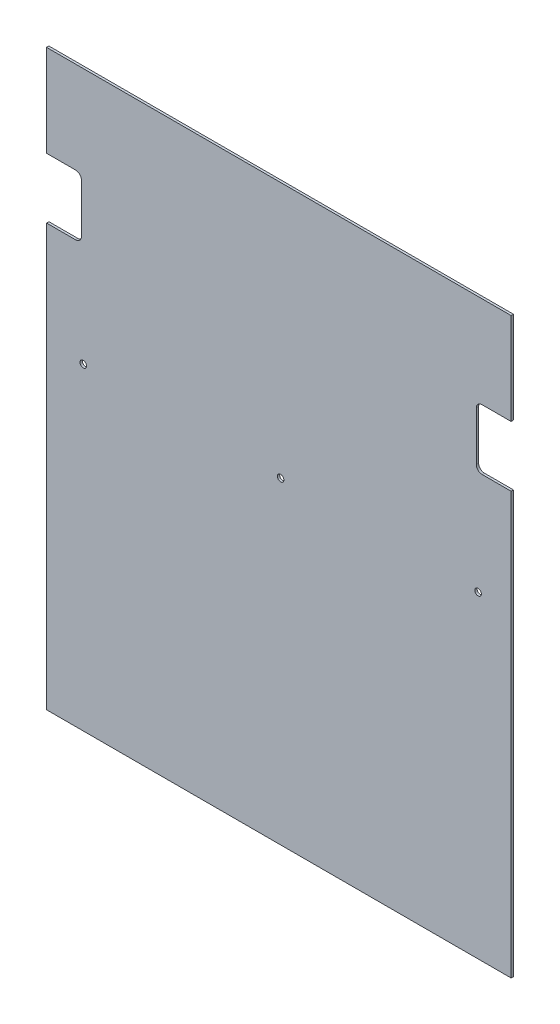
ISO-10303-21;
HEADER;
FILE_DESCRIPTION(('STEP AP214'),'2;1');
FILE_NAME('part.step','',(''),(''),'','','');
FILE_SCHEMA(('AUTOMOTIVE_DESIGN { 1 0 10303 214 1 1 1 1 }'));
ENDSEC;
DATA;
#1=APPLICATION_CONTEXT('core data for automotive mechanical design processes');
#2=APPLICATION_PROTOCOL_DEFINITION('international standard','automotive_design',2000,#1);
#3=PRODUCT_CONTEXT('',#1,'mechanical');
#4=PRODUCT('Part','Part','',(#3));
#5=PRODUCT_RELATED_PRODUCT_CATEGORY('part','',(#4));
#6=PRODUCT_DEFINITION_FORMATION('','',#4);
#7=PRODUCT_DEFINITION_CONTEXT('part definition',#1,'design');
#8=PRODUCT_DEFINITION('design','',#6,#7);
#9=PRODUCT_DEFINITION_SHAPE('','',#8);
#10=(LENGTH_UNIT() NAMED_UNIT(*) SI_UNIT(.MILLI.,.METRE.));
#11=(NAMED_UNIT(*) PLANE_ANGLE_UNIT() SI_UNIT($,.RADIAN.));
#12=(NAMED_UNIT(*) SI_UNIT($,.STERADIAN.) SOLID_ANGLE_UNIT());
#13=UNCERTAINTY_MEASURE_WITH_UNIT(LENGTH_MEASURE(1.E-05),#10,'distance_accuracy_value','');
#14=(GEOMETRIC_REPRESENTATION_CONTEXT(3) GLOBAL_UNCERTAINTY_ASSIGNED_CONTEXT((#13)) GLOBAL_UNIT_ASSIGNED_CONTEXT((#10,
#11,#12)) REPRESENTATION_CONTEXT('',''));
#15=CARTESIAN_POINT('',(0.,0.,0.));
#16=DIRECTION('',(0.,0.,1.));
#17=DIRECTION('',(1.,0.,0.));
#18=AXIS2_PLACEMENT_3D('',#15,#16,#17);
#19=CARTESIAN_POINT('',(200.,0.,2.));
#20=DIRECTION('',(1.,0.,0.));
#21=DIRECTION('',(0.,1.,0.));
#22=AXIS2_PLACEMENT_3D('',#19,#20,#21);
#23=PLANE('',#22);
#24=DIRECTION('',(0.,0.,1.));
#25=VECTOR('',#24,1.);
#26=CARTESIAN_POINT('',(200.,-131.,-8.));
#27=LINE('',#26,#25);
#28=CARTESIAN_POINT('',(200.,-131.,0.));
#29=VERTEX_POINT('',#28);
#30=CARTESIAN_POINT('',(200.,-131.,2.));
#31=VERTEX_POINT('',#30);
#32=EDGE_CURVE('E175',#29,#31,#27,.T.);
#33=ORIENTED_EDGE('',*,*,#32,.T.);
#34=DIRECTION('',(0.,-1.,0.));
#35=VECTOR('',#34,1.);
#36=CARTESIAN_POINT('',(200.,0.,2.));
#37=LINE('',#36,#35);
#38=CARTESIAN_POINT('',(200.,-494.,2.));
#39=VERTEX_POINT('',#38);
#40=EDGE_CURVE('E284',#31,#39,#37,.T.);
#41=ORIENTED_EDGE('',*,*,#40,.T.);
#42=DIRECTION('',(0.,0.,-1.));
#43=VECTOR('',#42,1.);
#44=CARTESIAN_POINT('',(200.,-494.,2.));
#45=LINE('',#44,#43);
#46=CARTESIAN_POINT('',(200.,-494.,0.));
#47=VERTEX_POINT('',#46);
#48=EDGE_CURVE('E210',#39,#47,#45,.T.);
#49=ORIENTED_EDGE('',*,*,#48,.T.);
#50=DIRECTION('',(0.,-1.,0.));
#51=VECTOR('',#50,1.);
#52=CARTESIAN_POINT('',(200.,0.,0.));
#53=LINE('',#52,#51);
#54=EDGE_CURVE('E193',#29,#47,#53,.T.);
#55=ORIENTED_EDGE('',*,*,#54,.F.);
#56=EDGE_LOOP('',(#33,#41,#49,#55));
#57=FACE_BOUND('',#56,.T.);
#58=ADVANCED_FACE('F39',(#57),#23,.T.);
#59=CARTESIAN_POINT('',(-200.,0.,2.));
#60=DIRECTION('',(1.,0.,0.));
#61=DIRECTION('',(0.,1.,0.));
#62=AXIS2_PLACEMENT_3D('',#59,#60,#61);
#63=PLANE('',#62);
#64=DIRECTION('',(0.,-1.,0.));
#65=VECTOR('',#64,1.);
#66=CARTESIAN_POINT('',(-200.,0.,0.));
#67=LINE('',#66,#65);
#68=CARTESIAN_POINT('',(-200.,0.,0.));
#69=VERTEX_POINT('',#68);
#70=CARTESIAN_POINT('',(-200.,-79.,0.));
#71=VERTEX_POINT('',#70);
#72=EDGE_CURVE('E201',#69,#71,#67,.T.);
#73=ORIENTED_EDGE('',*,*,#72,.T.);
#74=DIRECTION('',(0.,0.,1.));
#75=VECTOR('',#74,1.);
#76=CARTESIAN_POINT('',(-200.,-79.,-8.));
#77=LINE('',#76,#75);
#78=CARTESIAN_POINT('',(-200.,-79.,2.));
#79=VERTEX_POINT('',#78);
#80=EDGE_CURVE('E163',#71,#79,#77,.T.);
#81=ORIENTED_EDGE('',*,*,#80,.T.);
#82=DIRECTION('',(0.,-1.,0.));
#83=VECTOR('',#82,1.);
#84=CARTESIAN_POINT('',(-200.,0.,2.));
#85=LINE('',#84,#83);
#86=CARTESIAN_POINT('',(-200.,0.,2.));
#87=VERTEX_POINT('',#86);
#88=EDGE_CURVE('E181',#87,#79,#85,.T.);
#89=ORIENTED_EDGE('',*,*,#88,.F.);
#90=DIRECTION('',(0.,0.,-1.));
#91=VECTOR('',#90,1.);
#92=CARTESIAN_POINT('',(-200.,0.,2.));
#93=LINE('',#92,#91);
#94=EDGE_CURVE('E206',#87,#69,#93,.T.);
#95=ORIENTED_EDGE('',*,*,#94,.T.);
#96=EDGE_LOOP('',(#73,#81,#89,#95));
#97=FACE_BOUND('',#96,.T.);
#98=ADVANCED_FACE('F324',(#97),#63,.F.);
#99=CARTESIAN_POINT('',(0.,-494.,2.));
#100=DIRECTION('',(0.,1.,0.));
#101=DIRECTION('',(-1.,0.,0.));
#102=AXIS2_PLACEMENT_3D('',#99,#100,#101);
#103=PLANE('',#102);
#104=DIRECTION('',(1.,0.,0.));
#105=VECTOR('',#104,1.);
#106=CARTESIAN_POINT('',(0.,-494.,0.));
#107=LINE('',#106,#105);
#108=CARTESIAN_POINT('',(-200.,-494.,0.));
#109=VERTEX_POINT('',#108);
#110=EDGE_CURVE('E190',#109,#47,#107,.T.);
#111=ORIENTED_EDGE('',*,*,#110,.T.);
#112=ORIENTED_EDGE('',*,*,#48,.F.);
#113=DIRECTION('',(1.,0.,0.));
#114=VECTOR('',#113,1.);
#115=CARTESIAN_POINT('',(0.,-494.,2.));
#116=LINE('',#115,#114);
#117=CARTESIAN_POINT('',(-200.,-494.,2.));
#118=VERTEX_POINT('',#117);
#119=EDGE_CURVE('E204',#118,#39,#116,.T.);
#120=ORIENTED_EDGE('',*,*,#119,.F.);
#121=DIRECTION('',(0.,0.,-1.));
#122=VECTOR('',#121,1.);
#123=CARTESIAN_POINT('',(-200.,-494.,2.));
#124=LINE('',#123,#122);
#125=EDGE_CURVE('E179',#118,#109,#124,.T.);
#126=ORIENTED_EDGE('',*,*,#125,.T.);
#127=EDGE_LOOP('',(#111,#112,#120,#126));
#128=FACE_BOUND('',#127,.T.);
#129=ADVANCED_FACE('F296',(#128),#103,.F.);
#130=DIRECTION('',(0.,0.,1.));
#131=VECTOR('',#130,1.);
#132=CARTESIAN_POINT('',(200.,-78.9999999999999,-8.));
#133=LINE('',#132,#131);
#134=CARTESIAN_POINT('',(200.,-78.9999999999999,0.));
#135=VERTEX_POINT('',#134);
#136=CARTESIAN_POINT('',(200.,-78.9999999999999,2.));
#137=VERTEX_POINT('',#136);
#138=EDGE_CURVE('E280',#135,#137,#133,.T.);
#139=ORIENTED_EDGE('',*,*,#138,.F.);
#140=CARTESIAN_POINT('',(200.,0.,0.));
#141=VERTEX_POINT('',#140);
#142=EDGE_CURVE('E194',#141,#135,#53,.T.);
#143=ORIENTED_EDGE('',*,*,#142,.F.);
#144=DIRECTION('',(0.,0.,-1.));
#145=VECTOR('',#144,1.);
#146=CARTESIAN_POINT('',(200.,0.,2.));
#147=LINE('',#146,#145);
#148=CARTESIAN_POINT('',(200.,0.,2.));
#149=VERTEX_POINT('',#148);
#150=EDGE_CURVE('E208',#149,#141,#147,.T.);
#151=ORIENTED_EDGE('',*,*,#150,.F.);
#152=EDGE_CURVE('E186',#149,#137,#37,.T.);
#153=ORIENTED_EDGE('',*,*,#152,.T.);
#154=EDGE_LOOP('',(#139,#143,#151,#153));
#155=FACE_BOUND('',#154,.T.);
#156=ADVANCED_FACE('F326',(#155),#23,.T.);
#157=CARTESIAN_POINT('',(0.,0.,2.));
#158=DIRECTION('',(0.,1.,0.));
#159=DIRECTION('',(-1.,0.,0.));
#160=AXIS2_PLACEMENT_3D('',#157,#158,#159);
#161=PLANE('',#160);
#162=DIRECTION('',(1.,0.,0.));
#163=VECTOR('',#162,1.);
#164=CARTESIAN_POINT('',(0.,0.,0.));
#165=LINE('',#164,#163);
#166=EDGE_CURVE('E197',#69,#141,#165,.T.);
#167=ORIENTED_EDGE('',*,*,#166,.F.);
#168=ORIENTED_EDGE('',*,*,#94,.F.);
#169=DIRECTION('',(1.,0.,0.));
#170=VECTOR('',#169,1.);
#171=CARTESIAN_POINT('',(0.,0.,2.));
#172=LINE('',#171,#170);
#173=EDGE_CURVE('E182',#87,#149,#172,.T.);
#174=ORIENTED_EDGE('',*,*,#173,.T.);
#175=ORIENTED_EDGE('',*,*,#150,.T.);
#176=EDGE_LOOP('',(#167,#168,#174,#175));
#177=FACE_BOUND('',#176,.T.);
#178=ADVANCED_FACE('F335',(#177),#161,.T.);
#179=CARTESIAN_POINT('',(-200.,-131.,2.));
#180=VERTEX_POINT('',#179);
#181=EDGE_CURVE('E170',#180,#118,#85,.T.);
#182=ORIENTED_EDGE('',*,*,#181,.F.);
#183=DIRECTION('',(0.,0.,1.));
#184=VECTOR('',#183,1.);
#185=CARTESIAN_POINT('',(-200.,-131.,-8.));
#186=LINE('',#185,#184);
#187=CARTESIAN_POINT('',(-200.,-131.,0.));
#188=VERTEX_POINT('',#187);
#189=EDGE_CURVE('E153',#188,#180,#186,.T.);
#190=ORIENTED_EDGE('',*,*,#189,.F.);
#191=EDGE_CURVE('E200',#188,#109,#67,.T.);
#192=ORIENTED_EDGE('',*,*,#191,.T.);
#193=ORIENTED_EDGE('',*,*,#125,.F.);
#194=EDGE_LOOP('',(#182,#190,#192,#193));
#195=FACE_BOUND('',#194,.T.);
#196=ADVANCED_FACE('F177',(#195),#63,.F.);
#197=CARTESIAN_POINT('',(0.,0.,2.));
#198=DIRECTION('',(0.,0.,1.));
#199=DIRECTION('',(1.,0.,0.));
#200=AXIS2_PLACEMENT_3D('',#197,#198,#199);
#201=PLANE('',#200);
#202=CARTESIAN_POINT('',(-168.455486452755,-220.458154074216,2.));
#203=DIRECTION('',(0.,0.,-1.));
#204=DIRECTION('',(1.,0.,0.));
#205=AXIS2_PLACEMENT_3D('',#202,#203,#204);
#206=CIRCLE('',#205,2.82157287525372);
#207=CARTESIAN_POINT('',(-165.633913577501,-220.458154074216,2.));
#208=VERTEX_POINT('',#207);
#209=EDGE_CURVE('E476',#208,#208,#206,.T.);
#210=ORIENTED_EDGE('',*,*,#209,.T.);
#211=EDGE_LOOP('',(#210));
#212=FACE_BOUND('',#211,.T.);
#213=CARTESIAN_POINT('',(1.5445135472447,-220.458154074216,2.));
#214=DIRECTION('',(0.,0.,-1.));
#215=DIRECTION('',(-1.,0.,0.));
#216=AXIS2_PLACEMENT_3D('',#213,#214,#215);
#217=CIRCLE('',#216,2.82157287525376);
#218=CARTESIAN_POINT('',(4.36608642249846,-220.458154074216,2.));
#219=VERTEX_POINT('',#218);
#220=EDGE_CURVE('E477',#219,#219,#217,.T.);
#221=ORIENTED_EDGE('',*,*,#220,.T.);
#222=EDGE_LOOP('',(#221));
#223=FACE_BOUND('',#222,.T.);
#224=CARTESIAN_POINT('',(171.544513547245,-220.458154074216,2.));
#225=DIRECTION('',(0.,0.,-1.));
#226=DIRECTION('',(-1.,0.,0.));
#227=AXIS2_PLACEMENT_3D('',#224,#225,#226);
#228=CIRCLE('',#227,2.82157287525371);
#229=CARTESIAN_POINT('',(174.366086422498,-220.458154074216,2.));
#230=VERTEX_POINT('',#229);
#231=EDGE_CURVE('E260',#230,#230,#228,.T.);
#232=ORIENTED_EDGE('',*,*,#231,.T.);
#233=EDGE_LOOP('',(#232));
#234=FACE_BOUND('',#233,.T.);
#235=DIRECTION('',(-1.,0.,0.));
#236=VECTOR('',#235,1.);
#237=CARTESIAN_POINT('',(-200.,-79.,2.));
#238=LINE('',#237,#236);
#239=CARTESIAN_POINT('',(-175.,-79.,2.));
#240=VERTEX_POINT('',#239);
#241=EDGE_CURVE('E164',#240,#79,#238,.T.);
#242=ORIENTED_EDGE('',*,*,#241,.F.);
#243=CARTESIAN_POINT('',(-175.,-84.,2.));
#244=DIRECTION('',(0.,0.,1.));
#245=DIRECTION('',(1.,0.,0.));
#246=AXIS2_PLACEMENT_3D('',#243,#244,#245);
#247=CIRCLE('',#246,5.);
#248=CARTESIAN_POINT('',(-170.,-84.,2.));
#249=VERTEX_POINT('',#248);
#250=EDGE_CURVE('E48',#240,#249,#247,.F.);
#251=ORIENTED_EDGE('',*,*,#250,.T.);
#252=DIRECTION('',(0.,1.,0.));
#253=VECTOR('',#252,1.);
#254=CARTESIAN_POINT('',(-170.,-106.,2.));
#255=LINE('',#254,#253);
#256=CARTESIAN_POINT('',(-170.,-126.,2.));
#257=VERTEX_POINT('',#256);
#258=EDGE_CURVE('E174',#257,#249,#255,.T.);
#259=ORIENTED_EDGE('',*,*,#258,.F.);
#260=CARTESIAN_POINT('',(-175.,-126.,2.));
#261=DIRECTION('',(0.,0.,1.));
#262=DIRECTION('',(1.,0.,0.));
#263=AXIS2_PLACEMENT_3D('',#260,#261,#262);
#264=CIRCLE('',#263,5.);
#265=CARTESIAN_POINT('',(-175.,-131.,2.));
#266=VERTEX_POINT('',#265);
#267=EDGE_CURVE('E173',#257,#266,#264,.F.);
#268=ORIENTED_EDGE('',*,*,#267,.T.);
#269=DIRECTION('',(1.,0.,0.));
#270=VECTOR('',#269,1.);
#271=CARTESIAN_POINT('',(-200.,-131.,2.));
#272=LINE('',#271,#270);
#273=EDGE_CURVE('E156',#180,#266,#272,.T.);
#274=ORIENTED_EDGE('',*,*,#273,.F.);
#275=ORIENTED_EDGE('',*,*,#181,.T.);
#276=ORIENTED_EDGE('',*,*,#119,.T.);
#277=ORIENTED_EDGE('',*,*,#40,.F.);
#278=DIRECTION('',(1.,0.,0.));
#279=VECTOR('',#278,1.);
#280=CARTESIAN_POINT('',(200.,-131.,2.));
#281=LINE('',#280,#279);
#282=CARTESIAN_POINT('',(175.,-131.,2.));
#283=VERTEX_POINT('',#282);
#284=EDGE_CURVE('E275',#283,#31,#281,.T.);
#285=ORIENTED_EDGE('',*,*,#284,.F.);
#286=CARTESIAN_POINT('',(175.,-126.,2.));
#287=DIRECTION('',(0.,0.,1.));
#288=DIRECTION('',(1.,0.,0.));
#289=AXIS2_PLACEMENT_3D('',#286,#287,#288);
#290=CIRCLE('',#289,5.);
#291=CARTESIAN_POINT('',(170.,-126.,2.));
#292=VERTEX_POINT('',#291);
#293=EDGE_CURVE('E249',#283,#292,#290,.F.);
#294=ORIENTED_EDGE('',*,*,#293,.T.);
#295=DIRECTION('',(0.,-1.,0.));
#296=VECTOR('',#295,1.);
#297=CARTESIAN_POINT('',(170.,-131.,2.));
#298=LINE('',#297,#296);
#299=CARTESIAN_POINT('',(170.,-84.,2.));
#300=VERTEX_POINT('',#299);
#301=EDGE_CURVE('E269',#300,#292,#298,.T.);
#302=ORIENTED_EDGE('',*,*,#301,.F.);
#303=CARTESIAN_POINT('',(175.,-84.,2.));
#304=DIRECTION('',(0.,0.,1.));
#305=DIRECTION('',(1.,0.,0.));
#306=AXIS2_PLACEMENT_3D('',#303,#304,#305);
#307=CIRCLE('',#306,5.);
#308=CARTESIAN_POINT('',(175.,-79.,2.));
#309=VERTEX_POINT('',#308);
#310=EDGE_CURVE('E245',#300,#309,#307,.F.);
#311=ORIENTED_EDGE('',*,*,#310,.T.);
#312=DIRECTION('',(-1.,0.,0.));
#313=VECTOR('',#312,1.);
#314=CARTESIAN_POINT('',(200.,-78.9999999999999,2.));
#315=LINE('',#314,#313);
#316=EDGE_CURVE('E265',#137,#309,#315,.T.);
#317=ORIENTED_EDGE('',*,*,#316,.F.);
#318=ORIENTED_EDGE('',*,*,#152,.F.);
#319=ORIENTED_EDGE('',*,*,#173,.F.);
#320=ORIENTED_EDGE('',*,*,#88,.T.);
#321=EDGE_LOOP('',(#242,#251,#259,#268,#274,#275,#276,#277,#285,#294,#302,#311,#317,#318,#319,#320));
#322=FACE_BOUND('',#321,.T.);
#323=ADVANCED_FACE('F168',(#212,#223,#234,#322),#201,.T.);
#324=CARTESIAN_POINT('',(0.,0.,0.));
#325=DIRECTION('',(0.,0.,1.));
#326=DIRECTION('',(1.,0.,0.));
#327=AXIS2_PLACEMENT_3D('',#324,#325,#326);
#328=PLANE('',#327);
#329=CARTESIAN_POINT('',(-168.455486452755,-220.458154074216,0.));
#330=DIRECTION('',(0.,0.,1.));
#331=DIRECTION('',(1.,0.,0.));
#332=AXIS2_PLACEMENT_3D('',#329,#330,#331);
#333=CIRCLE('',#332,2.82157287525372);
#334=CARTESIAN_POINT('',(-165.633913577501,-220.458154074216,0.));
#335=VERTEX_POINT('',#334);
#336=EDGE_CURVE('E43',#335,#335,#333,.F.);
#337=ORIENTED_EDGE('',*,*,#336,.F.);
#338=EDGE_LOOP('',(#337));
#339=FACE_BOUND('',#338,.T.);
#340=CARTESIAN_POINT('',(1.5445135472447,-220.458154074216,0.));
#341=DIRECTION('',(0.,0.,1.));
#342=DIRECTION('',(1.,0.,0.));
#343=AXIS2_PLACEMENT_3D('',#340,#341,#342);
#344=CIRCLE('',#343,2.82157287525376);
#345=CARTESIAN_POINT('',(4.36608642249846,-220.458154074216,0.));
#346=VERTEX_POINT('',#345);
#347=EDGE_CURVE('E259',#346,#346,#344,.F.);
#348=ORIENTED_EDGE('',*,*,#347,.F.);
#349=EDGE_LOOP('',(#348));
#350=FACE_BOUND('',#349,.T.);
#351=CARTESIAN_POINT('',(171.544513547245,-220.458154074216,0.));
#352=DIRECTION('',(0.,0.,1.));
#353=DIRECTION('',(1.,0.,0.));
#354=AXIS2_PLACEMENT_3D('',#351,#352,#353);
#355=CIRCLE('',#354,2.82157287525371);
#356=CARTESIAN_POINT('',(174.366086422498,-220.458154074216,0.));
#357=VERTEX_POINT('',#356);
#358=EDGE_CURVE('E257',#357,#357,#355,.F.);
#359=ORIENTED_EDGE('',*,*,#358,.F.);
#360=EDGE_LOOP('',(#359));
#361=FACE_BOUND('',#360,.T.);
#362=DIRECTION('',(1.,0.,0.));
#363=VECTOR('',#362,1.);
#364=CARTESIAN_POINT('',(0.,-131.,0.));
#365=LINE('',#364,#363);
#366=CARTESIAN_POINT('',(-175.,-131.,0.));
#367=VERTEX_POINT('',#366);
#368=EDGE_CURVE('E159',#188,#367,#365,.T.);
#369=ORIENTED_EDGE('',*,*,#368,.T.);
#370=CARTESIAN_POINT('',(-175.,-126.,0.));
#371=DIRECTION('',(0.,0.,1.));
#372=DIRECTION('',(1.,0.,0.));
#373=AXIS2_PLACEMENT_3D('',#370,#371,#372);
#374=CIRCLE('',#373,5.);
#375=CARTESIAN_POINT('',(-170.,-126.,0.));
#376=VERTEX_POINT('',#375);
#377=EDGE_CURVE('E254',#367,#376,#374,.T.);
#378=ORIENTED_EDGE('',*,*,#377,.T.);
#379=DIRECTION('',(0.,1.,0.));
#380=VECTOR('',#379,1.);
#381=CARTESIAN_POINT('',(-170.,0.,0.));
#382=LINE('',#381,#380);
#383=CARTESIAN_POINT('',(-170.,-84.,0.));
#384=VERTEX_POINT('',#383);
#385=EDGE_CURVE('E222',#376,#384,#382,.T.);
#386=ORIENTED_EDGE('',*,*,#385,.T.);
#387=CARTESIAN_POINT('',(-175.,-84.,0.));
#388=DIRECTION('',(0.,0.,1.));
#389=DIRECTION('',(1.,0.,0.));
#390=AXIS2_PLACEMENT_3D('',#387,#388,#389);
#391=CIRCLE('',#390,5.);
#392=CARTESIAN_POINT('',(-175.,-79.,0.));
#393=VERTEX_POINT('',#392);
#394=EDGE_CURVE('E11',#384,#393,#391,.T.);
#395=ORIENTED_EDGE('',*,*,#394,.T.);
#396=DIRECTION('',(-1.,0.,0.));
#397=VECTOR('',#396,1.);
#398=CARTESIAN_POINT('',(0.,-79.,0.));
#399=LINE('',#398,#397);
#400=EDGE_CURVE('E224',#393,#71,#399,.T.);
#401=ORIENTED_EDGE('',*,*,#400,.T.);
#402=ORIENTED_EDGE('',*,*,#72,.F.);
#403=ORIENTED_EDGE('',*,*,#166,.T.);
#404=ORIENTED_EDGE('',*,*,#142,.T.);
#405=DIRECTION('',(-1.,0.,0.));
#406=VECTOR('',#405,1.);
#407=CARTESIAN_POINT('',(0.,-79.,0.));
#408=LINE('',#407,#406);
#409=CARTESIAN_POINT('',(175.,-79.,0.));
#410=VERTEX_POINT('',#409);
#411=EDGE_CURVE('E213',#135,#410,#408,.T.);
#412=ORIENTED_EDGE('',*,*,#411,.T.);
#413=CARTESIAN_POINT('',(175.,-84.,0.));
#414=DIRECTION('',(0.,0.,1.));
#415=DIRECTION('',(1.,0.,0.));
#416=AXIS2_PLACEMENT_3D('',#413,#414,#415);
#417=CIRCLE('',#416,5.);
#418=CARTESIAN_POINT('',(170.,-84.,0.));
#419=VERTEX_POINT('',#418);
#420=EDGE_CURVE('E247',#410,#419,#417,.T.);
#421=ORIENTED_EDGE('',*,*,#420,.T.);
#422=DIRECTION('',(0.,-1.,0.));
#423=VECTOR('',#422,1.);
#424=CARTESIAN_POINT('',(170.,3.77475828372553E-13,0.));
#425=LINE('',#424,#423);
#426=CARTESIAN_POINT('',(170.,-126.,0.));
#427=VERTEX_POINT('',#426);
#428=EDGE_CURVE('E216',#419,#427,#425,.T.);
#429=ORIENTED_EDGE('',*,*,#428,.T.);
#430=CARTESIAN_POINT('',(175.,-126.,0.));
#431=DIRECTION('',(0.,0.,1.));
#432=DIRECTION('',(1.,0.,0.));
#433=AXIS2_PLACEMENT_3D('',#430,#431,#432);
#434=CIRCLE('',#433,5.);
#435=CARTESIAN_POINT('',(175.,-131.,0.));
#436=VERTEX_POINT('',#435);
#437=EDGE_CURVE('E251',#427,#436,#434,.T.);
#438=ORIENTED_EDGE('',*,*,#437,.T.);
#439=DIRECTION('',(1.,0.,0.));
#440=VECTOR('',#439,1.);
#441=CARTESIAN_POINT('',(0.,-131.,0.));
#442=LINE('',#441,#440);
#443=EDGE_CURVE('E219',#436,#29,#442,.T.);
#444=ORIENTED_EDGE('',*,*,#443,.T.);
#445=ORIENTED_EDGE('',*,*,#54,.T.);
#446=ORIENTED_EDGE('',*,*,#110,.F.);
#447=ORIENTED_EDGE('',*,*,#191,.F.);
#448=EDGE_LOOP('',(#369,#378,#386,#395,#401,#402,#403,#404,#412,#421,#429,#438,#444,#445,#446,#447));
#449=FACE_BOUND('',#448,.T.);
#450=ADVANCED_FACE('F298',(#339,#350,#361,#449),#328,.F.);
#451=CARTESIAN_POINT('',(200.,-131.,-8.));
#452=DIRECTION('',(0.,-1.,0.));
#453=DIRECTION('',(0.,0.,-1.));
#454=AXIS2_PLACEMENT_3D('',#451,#452,#453);
#455=PLANE('',#454);
#456=ORIENTED_EDGE('',*,*,#443,.F.);
#457=DIRECTION('',(0.,0.,1.));
#458=VECTOR('',#457,1.);
#459=CARTESIAN_POINT('',(175.,-131.,2.));
#460=LINE('',#459,#458);
#461=EDGE_CURVE('E233',#436,#283,#460,.T.);
#462=ORIENTED_EDGE('',*,*,#461,.T.);
#463=ORIENTED_EDGE('',*,*,#284,.T.);
#464=ORIENTED_EDGE('',*,*,#32,.F.);
#465=EDGE_LOOP('',(#456,#462,#463,#464));
#466=FACE_BOUND('',#465,.T.);
#467=ADVANCED_FACE('F303',(#466),#455,.F.);
#468=CARTESIAN_POINT('',(170.,-131.,-8.));
#469=DIRECTION('',(-1.,0.,0.));
#470=DIRECTION('',(0.,-1.,0.));
#471=AXIS2_PLACEMENT_3D('',#468,#469,#470);
#472=PLANE('',#471);
#473=ORIENTED_EDGE('',*,*,#428,.F.);
#474=DIRECTION('',(0.,0.,1.));
#475=VECTOR('',#474,1.);
#476=CARTESIAN_POINT('',(170.,-84.,2.));
#477=LINE('',#476,#475);
#478=EDGE_CURVE('E228',#419,#300,#477,.T.);
#479=ORIENTED_EDGE('',*,*,#478,.T.);
#480=ORIENTED_EDGE('',*,*,#301,.T.);
#481=DIRECTION('',(0.,0.,1.));
#482=VECTOR('',#481,1.);
#483=CARTESIAN_POINT('',(170.,-126.,0.));
#484=LINE('',#483,#482);
#485=EDGE_CURVE('E226',#292,#427,#484,.F.);
#486=ORIENTED_EDGE('',*,*,#485,.T.);
#487=EDGE_LOOP('',(#473,#479,#480,#486));
#488=FACE_BOUND('',#487,.T.);
#489=ADVANCED_FACE('F309',(#488),#472,.F.);
#490=CARTESIAN_POINT('',(200.,-78.9999999999999,-8.));
#491=DIRECTION('',(0.,1.,0.));
#492=DIRECTION('',(-1.,0.,0.));
#493=AXIS2_PLACEMENT_3D('',#490,#491,#492);
#494=PLANE('',#493);
#495=ORIENTED_EDGE('',*,*,#316,.T.);
#496=DIRECTION('',(0.,0.,1.));
#497=VECTOR('',#496,1.);
#498=CARTESIAN_POINT('',(175.,-79.,0.));
#499=LINE('',#498,#497);
#500=EDGE_CURVE('E231',#309,#410,#499,.F.);
#501=ORIENTED_EDGE('',*,*,#500,.T.);
#502=ORIENTED_EDGE('',*,*,#411,.F.);
#503=ORIENTED_EDGE('',*,*,#138,.T.);
#504=EDGE_LOOP('',(#495,#501,#502,#503));
#505=FACE_BOUND('',#504,.T.);
#506=ADVANCED_FACE('F347',(#505),#494,.F.);
#507=CARTESIAN_POINT('',(-200.,-79.,-8.));
#508=DIRECTION('',(0.,1.,0.));
#509=DIRECTION('',(0.,0.,1.));
#510=AXIS2_PLACEMENT_3D('',#507,#508,#509);
#511=PLANE('',#510);
#512=ORIENTED_EDGE('',*,*,#400,.F.);
#513=DIRECTION('',(0.,0.,1.));
#514=VECTOR('',#513,1.);
#515=CARTESIAN_POINT('',(-175.,-79.,2.));
#516=LINE('',#515,#514);
#517=EDGE_CURVE('E243',#393,#240,#516,.T.);
#518=ORIENTED_EDGE('',*,*,#517,.T.);
#519=ORIENTED_EDGE('',*,*,#241,.T.);
#520=ORIENTED_EDGE('',*,*,#80,.F.);
#521=EDGE_LOOP('',(#512,#518,#519,#520));
#522=FACE_BOUND('',#521,.T.);
#523=ADVANCED_FACE('F349',(#522),#511,.F.);
#524=CARTESIAN_POINT('',(-170.,-106.,-8.));
#525=DIRECTION('',(1.,0.,0.));
#526=DIRECTION('',(0.,0.,-1.));
#527=AXIS2_PLACEMENT_3D('',#524,#525,#526);
#528=PLANE('',#527);
#529=ORIENTED_EDGE('',*,*,#385,.F.);
#530=DIRECTION('',(0.,0.,1.));
#531=VECTOR('',#530,1.);
#532=CARTESIAN_POINT('',(-170.,-126.,2.));
#533=LINE('',#532,#531);
#534=EDGE_CURVE('E238',#376,#257,#533,.T.);
#535=ORIENTED_EDGE('',*,*,#534,.T.);
#536=ORIENTED_EDGE('',*,*,#258,.T.);
#537=DIRECTION('',(0.,0.,1.));
#538=VECTOR('',#537,1.);
#539=CARTESIAN_POINT('',(-170.,-84.,0.));
#540=LINE('',#539,#538);
#541=EDGE_CURVE('E236',#249,#384,#540,.F.);
#542=ORIENTED_EDGE('',*,*,#541,.T.);
#543=EDGE_LOOP('',(#529,#535,#536,#542));
#544=FACE_BOUND('',#543,.T.);
#545=ADVANCED_FACE('F355',(#544),#528,.F.);
#546=CARTESIAN_POINT('',(-200.,-131.,-8.));
#547=DIRECTION('',(0.,-1.,0.));
#548=DIRECTION('',(0.,0.,-1.));
#549=AXIS2_PLACEMENT_3D('',#546,#547,#548);
#550=PLANE('',#549);
#551=ORIENTED_EDGE('',*,*,#273,.T.);
#552=DIRECTION('',(0.,0.,1.));
#553=VECTOR('',#552,1.);
#554=CARTESIAN_POINT('',(-175.,-131.,0.));
#555=LINE('',#554,#553);
#556=EDGE_CURVE('E241',#266,#367,#555,.F.);
#557=ORIENTED_EDGE('',*,*,#556,.T.);
#558=ORIENTED_EDGE('',*,*,#368,.F.);
#559=ORIENTED_EDGE('',*,*,#189,.T.);
#560=EDGE_LOOP('',(#551,#557,#558,#559));
#561=FACE_BOUND('',#560,.T.);
#562=ADVANCED_FACE('F155',(#561),#550,.F.);
#563=CARTESIAN_POINT('',(175.,-84.,-8.));
#564=DIRECTION('',(0.,0.,-1.));
#565=DIRECTION('',(-1.,0.,0.));
#566=AXIS2_PLACEMENT_3D('',#563,#564,#565);
#567=CYLINDRICAL_SURFACE('',#566,5.);
#568=ORIENTED_EDGE('',*,*,#420,.F.);
#569=ORIENTED_EDGE('',*,*,#500,.F.);
#570=ORIENTED_EDGE('',*,*,#310,.F.);
#571=ORIENTED_EDGE('',*,*,#478,.F.);
#572=EDGE_LOOP('',(#568,#569,#570,#571));
#573=FACE_BOUND('',#572,.T.);
#574=ADVANCED_FACE('F314',(#573),#567,.F.);
#575=CARTESIAN_POINT('',(175.,-126.,-8.));
#576=DIRECTION('',(0.,0.,-1.));
#577=DIRECTION('',(-1.,0.,0.));
#578=AXIS2_PLACEMENT_3D('',#575,#576,#577);
#579=CYLINDRICAL_SURFACE('',#578,5.);
#580=ORIENTED_EDGE('',*,*,#437,.F.);
#581=ORIENTED_EDGE('',*,*,#485,.F.);
#582=ORIENTED_EDGE('',*,*,#293,.F.);
#583=ORIENTED_EDGE('',*,*,#461,.F.);
#584=EDGE_LOOP('',(#580,#581,#582,#583));
#585=FACE_BOUND('',#584,.T.);
#586=ADVANCED_FACE('F311',(#585),#579,.F.);
#587=CARTESIAN_POINT('',(-175.,-126.,-8.));
#588=DIRECTION('',(0.,0.,-1.));
#589=DIRECTION('',(-1.,0.,0.));
#590=AXIS2_PLACEMENT_3D('',#587,#588,#589);
#591=CYLINDRICAL_SURFACE('',#590,5.);
#592=ORIENTED_EDGE('',*,*,#377,.F.);
#593=ORIENTED_EDGE('',*,*,#556,.F.);
#594=ORIENTED_EDGE('',*,*,#267,.F.);
#595=ORIENTED_EDGE('',*,*,#534,.F.);
#596=EDGE_LOOP('',(#592,#593,#594,#595));
#597=FACE_BOUND('',#596,.T.);
#598=ADVANCED_FACE('F313',(#597),#591,.F.);
#599=CARTESIAN_POINT('',(-175.,-84.,-8.));
#600=DIRECTION('',(0.,0.,-1.));
#601=DIRECTION('',(-1.,0.,0.));
#602=AXIS2_PLACEMENT_3D('',#599,#600,#601);
#603=CYLINDRICAL_SURFACE('',#602,5.);
#604=ORIENTED_EDGE('',*,*,#394,.F.);
#605=ORIENTED_EDGE('',*,*,#541,.F.);
#606=ORIENTED_EDGE('',*,*,#250,.F.);
#607=ORIENTED_EDGE('',*,*,#517,.F.);
#608=EDGE_LOOP('',(#604,#605,#606,#607));
#609=FACE_BOUND('',#608,.T.);
#610=ADVANCED_FACE('F41',(#609),#603,.F.);
#611=CARTESIAN_POINT('',(171.544513547245,-220.458154074216,-58.));
#612=DIRECTION('',(0.,0.,1.));
#613=DIRECTION('',(1.,0.,0.));
#614=AXIS2_PLACEMENT_3D('',#611,#612,#613);
#615=CYLINDRICAL_SURFACE('',#614,2.82157287525371);
#616=CARTESIAN_POINT('',(174.366086422498,-220.458154074216,2.));
#617=CARTESIAN_POINT('',(174.366086422498,-220.458154074216,1.97916666666667));
#618=CARTESIAN_POINT('',(174.366086422498,-220.458154074216,1.95833333333334));
#619=CARTESIAN_POINT('',(174.366086422498,-220.458154074216,1.91666666666667));
#620=CARTESIAN_POINT('',(174.366086422498,-220.458154074216,1.89583333333334));
#621=CARTESIAN_POINT('',(174.366086422498,-220.458154074216,1.85416666666667));
#622=CARTESIAN_POINT('',(174.366086422498,-220.458154074216,1.83333333333334));
#623=CARTESIAN_POINT('',(174.366086422498,-220.458154074216,1.79166666666667));
#624=CARTESIAN_POINT('',(174.366086422498,-220.458154074216,1.77083333333334));
#625=CARTESIAN_POINT('',(174.366086422498,-220.458154074216,1.72916666666667));
#626=CARTESIAN_POINT('',(174.366086422498,-220.458154074216,1.70833333333333));
#627=CARTESIAN_POINT('',(174.366086422498,-220.458154074216,1.66666666666667));
#628=CARTESIAN_POINT('',(174.366086422498,-220.458154074216,1.64583333333333));
#629=CARTESIAN_POINT('',(174.366086422498,-220.458154074216,1.60416666666667));
#630=CARTESIAN_POINT('',(174.366086422498,-220.458154074216,1.58333333333333));
#631=CARTESIAN_POINT('',(174.366086422498,-220.458154074216,1.54166666666667));
#632=CARTESIAN_POINT('',(174.366086422498,-220.458154074216,1.52083333333333));
#633=CARTESIAN_POINT('',(174.366086422498,-220.458154074216,1.47916666666667));
#634=CARTESIAN_POINT('',(174.366086422498,-220.458154074216,1.45833333333333));
#635=CARTESIAN_POINT('',(174.366086422498,-220.458154074216,1.41666666666667));
#636=CARTESIAN_POINT('',(174.366086422498,-220.458154074216,1.39583333333333));
#637=CARTESIAN_POINT('',(174.366086422498,-220.458154074216,1.35416666666667));
#638=CARTESIAN_POINT('',(174.366086422498,-220.458154074216,1.33333333333333));
#639=CARTESIAN_POINT('',(174.366086422498,-220.458154074216,1.29166666666667));
#640=CARTESIAN_POINT('',(174.366086422498,-220.458154074216,1.27083333333333));
#641=CARTESIAN_POINT('',(174.366086422498,-220.458154074216,1.22916666666667));
#642=CARTESIAN_POINT('',(174.366086422498,-220.458154074216,1.20833333333333));
#643=CARTESIAN_POINT('',(174.366086422498,-220.458154074216,1.16666666666667));
#644=CARTESIAN_POINT('',(174.366086422498,-220.458154074216,1.14583333333333));
#645=CARTESIAN_POINT('',(174.366086422498,-220.458154074216,1.10416666666667));
#646=CARTESIAN_POINT('',(174.366086422498,-220.458154074216,1.08333333333333));
#647=CARTESIAN_POINT('',(174.366086422498,-220.458154074216,1.04166666666667));
#648=CARTESIAN_POINT('',(174.366086422498,-220.458154074216,1.02083333333333));
#649=CARTESIAN_POINT('',(174.366086422498,-220.458154074216,0.979166666666668));
#650=CARTESIAN_POINT('',(174.366086422498,-220.458154074216,0.958333333333334));
#651=CARTESIAN_POINT('',(174.366086422498,-220.458154074216,0.916666666666668));
#652=CARTESIAN_POINT('',(174.366086422498,-220.458154074216,0.895833333333334));
#653=CARTESIAN_POINT('',(174.366086422498,-220.458154074216,0.854166666666667));
#654=CARTESIAN_POINT('',(174.366086422498,-220.458154074216,0.833333333333334));
#655=CARTESIAN_POINT('',(174.366086422498,-220.458154074216,0.791666666666667));
#656=CARTESIAN_POINT('',(174.366086422498,-220.458154074216,0.770833333333334));
#657=CARTESIAN_POINT('',(174.366086422498,-220.458154074216,0.729166666666667));
#658=CARTESIAN_POINT('',(174.366086422498,-220.458154074216,0.708333333333334));
#659=CARTESIAN_POINT('',(174.366086422498,-220.458154074216,0.666666666666667));
#660=CARTESIAN_POINT('',(174.366086422498,-220.458154074216,0.645833333333334));
#661=CARTESIAN_POINT('',(174.366086422498,-220.458154074216,0.604166666666667));
#662=CARTESIAN_POINT('',(174.366086422498,-220.458154074216,0.583333333333334));
#663=CARTESIAN_POINT('',(174.366086422498,-220.458154074216,0.541666666666667));
#664=CARTESIAN_POINT('',(174.366086422498,-220.458154074216,0.520833333333334));
#665=CARTESIAN_POINT('',(174.366086422498,-220.458154074216,0.479166666666667));
#666=CARTESIAN_POINT('',(174.366086422498,-220.458154074216,0.458333333333334));
#667=CARTESIAN_POINT('',(174.366086422498,-220.458154074216,0.416666666666667));
#668=CARTESIAN_POINT('',(174.366086422498,-220.458154074216,0.395833333333334));
#669=CARTESIAN_POINT('',(174.366086422498,-220.458154074216,0.354166666666667));
#670=CARTESIAN_POINT('',(174.366086422498,-220.458154074216,0.333333333333334));
#671=CARTESIAN_POINT('',(174.366086422498,-220.458154074216,0.291666666666667));
#672=CARTESIAN_POINT('',(174.366086422498,-220.458154074216,0.270833333333334));
#673=CARTESIAN_POINT('',(174.366086422498,-220.458154074216,0.229166666666667));
#674=CARTESIAN_POINT('',(174.366086422498,-220.458154074216,0.208333333333334));
#675=CARTESIAN_POINT('',(174.366086422498,-220.458154074216,0.166666666666667));
#676=CARTESIAN_POINT('',(174.366086422498,-220.458154074216,0.145833333333333));
#677=CARTESIAN_POINT('',(174.366086422498,-220.458154074216,0.104166666666667));
#678=CARTESIAN_POINT('',(174.366086422498,-220.458154074216,0.0833333333333334));
#679=CARTESIAN_POINT('',(174.366086422498,-220.458154074216,0.0416666666666667));
#680=CARTESIAN_POINT('',(174.366086422498,-220.458154074216,0.0208333333333333));
#681=CARTESIAN_POINT('',(174.366086422498,-220.458154074216,0.));
#682=B_SPLINE_CURVE_WITH_KNOTS('',3,(#616,#617,#618,#619,#620,#621,#622,#623,#624,#625,#626,
#627,#628,#629,#630,#631,#632,#633,#634,#635,#636,#637,#638,#639,#640,#641,#642,#643,#644,#645,
#646,#647,#648,#649,#650,#651,#652,#653,#654,#655,#656,#657,#658,#659,#660,#661,#662,#663,#664,
#665,#666,#667,#668,#669,#670,#671,#672,#673,#674,#675,#676,#677,#678,#679,#680,#681),
.UNSPECIFIED.,.F.,.F.,(4,2,2,2,2,2,2,2,2,2,2,2,2,2,2,2,2,2,2,2,2,2,2,2,2,2,2,2,2,2,2,2,4),(0.,
0.0625000000000001,0.125,0.1875,0.25,0.3125,0.375,0.4375,0.5,0.5625,0.625000000000001,
0.687500000000001,0.750000000000001,0.812500000000001,0.875000000000001,0.937500000000001,1.,
1.0625,1.125,1.1875,1.25,1.3125,1.375,1.4375,1.5,1.5625,1.625,1.6875,1.75,1.8125,1.875,1.9375,
2.),.UNSPECIFIED.);
#683=EDGE_CURVE('BSEAM442',#230,#357,#682,.T.);
#684=ORIENTED_EDGE('',*,*,#231,.F.);
#685=ORIENTED_EDGE('',*,*,#358,.T.);
#686=ORIENTED_EDGE('',*,*,#683,.T.);
#687=ORIENTED_EDGE('',*,*,#683,.F.);
#688=EDGE_LOOP('',(#684,#686,#685,#687));
#689=FACE_BOUND('',#688,.T.);
#690=ADVANCED_FACE('F442',(#689),#615,.F.);
#691=CARTESIAN_POINT('',(1.5445135472447,-220.458154074216,-58.));
#692=DIRECTION('',(0.,0.,1.));
#693=DIRECTION('',(1.,0.,0.));
#694=AXIS2_PLACEMENT_3D('',#691,#692,#693);
#695=CYLINDRICAL_SURFACE('',#694,2.82157287525376);
#696=CARTESIAN_POINT('',(4.36608642249846,-220.458154074216,2.));
#697=CARTESIAN_POINT('',(4.36608642249846,-220.458154074216,1.97916666666667));
#698=CARTESIAN_POINT('',(4.36608642249846,-220.458154074216,1.95833333333334));
#699=CARTESIAN_POINT('',(4.36608642249846,-220.458154074216,1.91666666666667));
#700=CARTESIAN_POINT('',(4.36608642249846,-220.458154074216,1.89583333333334));
#701=CARTESIAN_POINT('',(4.36608642249846,-220.458154074216,1.85416666666667));
#702=CARTESIAN_POINT('',(4.36608642249846,-220.458154074216,1.83333333333334));
#703=CARTESIAN_POINT('',(4.36608642249846,-220.458154074216,1.79166666666667));
#704=CARTESIAN_POINT('',(4.36608642249846,-220.458154074216,1.77083333333334));
#705=CARTESIAN_POINT('',(4.36608642249846,-220.458154074216,1.72916666666667));
#706=CARTESIAN_POINT('',(4.36608642249846,-220.458154074216,1.70833333333333));
#707=CARTESIAN_POINT('',(4.36608642249846,-220.458154074216,1.66666666666667));
#708=CARTESIAN_POINT('',(4.36608642249846,-220.458154074216,1.64583333333333));
#709=CARTESIAN_POINT('',(4.36608642249846,-220.458154074216,1.60416666666667));
#710=CARTESIAN_POINT('',(4.36608642249846,-220.458154074216,1.58333333333333));
#711=CARTESIAN_POINT('',(4.36608642249846,-220.458154074216,1.54166666666667));
#712=CARTESIAN_POINT('',(4.36608642249846,-220.458154074216,1.52083333333333));
#713=CARTESIAN_POINT('',(4.36608642249846,-220.458154074216,1.47916666666667));
#714=CARTESIAN_POINT('',(4.36608642249846,-220.458154074216,1.45833333333333));
#715=CARTESIAN_POINT('',(4.36608642249846,-220.458154074216,1.41666666666667));
#716=CARTESIAN_POINT('',(4.36608642249846,-220.458154074216,1.39583333333333));
#717=CARTESIAN_POINT('',(4.36608642249846,-220.458154074216,1.35416666666667));
#718=CARTESIAN_POINT('',(4.36608642249846,-220.458154074216,1.33333333333333));
#719=CARTESIAN_POINT('',(4.36608642249846,-220.458154074216,1.29166666666667));
#720=CARTESIAN_POINT('',(4.36608642249846,-220.458154074216,1.27083333333333));
#721=CARTESIAN_POINT('',(4.36608642249846,-220.458154074216,1.22916666666667));
#722=CARTESIAN_POINT('',(4.36608642249846,-220.458154074216,1.20833333333333));
#723=CARTESIAN_POINT('',(4.36608642249846,-220.458154074216,1.16666666666667));
#724=CARTESIAN_POINT('',(4.36608642249846,-220.458154074216,1.14583333333333));
#725=CARTESIAN_POINT('',(4.36608642249846,-220.458154074216,1.10416666666667));
#726=CARTESIAN_POINT('',(4.36608642249846,-220.458154074216,1.08333333333333));
#727=CARTESIAN_POINT('',(4.36608642249846,-220.458154074216,1.04166666666667));
#728=CARTESIAN_POINT('',(4.36608642249846,-220.458154074216,1.02083333333333));
#729=CARTESIAN_POINT('',(4.36608642249846,-220.458154074216,0.979166666666668));
#730=CARTESIAN_POINT('',(4.36608642249846,-220.458154074216,0.958333333333334));
#731=CARTESIAN_POINT('',(4.36608642249846,-220.458154074216,0.916666666666668));
#732=CARTESIAN_POINT('',(4.36608642249846,-220.458154074216,0.895833333333334));
#733=CARTESIAN_POINT('',(4.36608642249846,-220.458154074216,0.854166666666667));
#734=CARTESIAN_POINT('',(4.36608642249846,-220.458154074216,0.833333333333334));
#735=CARTESIAN_POINT('',(4.36608642249846,-220.458154074216,0.791666666666667));
#736=CARTESIAN_POINT('',(4.36608642249846,-220.458154074216,0.770833333333334));
#737=CARTESIAN_POINT('',(4.36608642249846,-220.458154074216,0.729166666666667));
#738=CARTESIAN_POINT('',(4.36608642249846,-220.458154074216,0.708333333333334));
#739=CARTESIAN_POINT('',(4.36608642249846,-220.458154074216,0.666666666666667));
#740=CARTESIAN_POINT('',(4.36608642249846,-220.458154074216,0.645833333333334));
#741=CARTESIAN_POINT('',(4.36608642249846,-220.458154074216,0.604166666666667));
#742=CARTESIAN_POINT('',(4.36608642249846,-220.458154074216,0.583333333333334));
#743=CARTESIAN_POINT('',(4.36608642249846,-220.458154074216,0.541666666666667));
#744=CARTESIAN_POINT('',(4.36608642249846,-220.458154074216,0.520833333333334));
#745=CARTESIAN_POINT('',(4.36608642249846,-220.458154074216,0.479166666666667));
#746=CARTESIAN_POINT('',(4.36608642249846,-220.458154074216,0.458333333333334));
#747=CARTESIAN_POINT('',(4.36608642249846,-220.458154074216,0.416666666666667));
#748=CARTESIAN_POINT('',(4.36608642249846,-220.458154074216,0.395833333333334));
#749=CARTESIAN_POINT('',(4.36608642249846,-220.458154074216,0.354166666666667));
#750=CARTESIAN_POINT('',(4.36608642249846,-220.458154074216,0.333333333333334));
#751=CARTESIAN_POINT('',(4.36608642249846,-220.458154074216,0.291666666666667));
#752=CARTESIAN_POINT('',(4.36608642249846,-220.458154074216,0.270833333333334));
#753=CARTESIAN_POINT('',(4.36608642249846,-220.458154074216,0.229166666666667));
#754=CARTESIAN_POINT('',(4.36608642249846,-220.458154074216,0.208333333333334));
#755=CARTESIAN_POINT('',(4.36608642249846,-220.458154074216,0.166666666666667));
#756=CARTESIAN_POINT('',(4.36608642249846,-220.458154074216,0.145833333333333));
#757=CARTESIAN_POINT('',(4.36608642249846,-220.458154074216,0.104166666666667));
#758=CARTESIAN_POINT('',(4.36608642249846,-220.458154074216,0.0833333333333334));
#759=CARTESIAN_POINT('',(4.36608642249846,-220.458154074216,0.0416666666666667));
#760=CARTESIAN_POINT('',(4.36608642249846,-220.458154074216,0.0208333333333333));
#761=CARTESIAN_POINT('',(4.36608642249846,-220.458154074216,0.));
#762=B_SPLINE_CURVE_WITH_KNOTS('',3,(#696,#697,#698,#699,#700,#701,#702,#703,#704,#705,#706,
#707,#708,#709,#710,#711,#712,#713,#714,#715,#716,#717,#718,#719,#720,#721,#722,#723,#724,#725,
#726,#727,#728,#729,#730,#731,#732,#733,#734,#735,#736,#737,#738,#739,#740,#741,#742,#743,#744,
#745,#746,#747,#748,#749,#750,#751,#752,#753,#754,#755,#756,#757,#758,#759,#760,#761),
.UNSPECIFIED.,.F.,.F.,(4,2,2,2,2,2,2,2,2,2,2,2,2,2,2,2,2,2,2,2,2,2,2,2,2,2,2,2,2,2,2,2,4),(0.,
0.0625000000000001,0.125,0.1875,0.25,0.3125,0.375,0.4375,0.5,0.5625,0.625000000000001,
0.687500000000001,0.750000000000001,0.812500000000001,0.875000000000001,0.937500000000001,1.,
1.0625,1.125,1.1875,1.25,1.3125,1.375,1.4375,1.5,1.5625,1.625,1.6875,1.75,1.8125,1.875,1.9375,
2.),.UNSPECIFIED.);
#763=EDGE_CURVE('BSEAM450',#219,#346,#762,.T.);
#764=ORIENTED_EDGE('',*,*,#220,.F.);
#765=ORIENTED_EDGE('',*,*,#347,.T.);
#766=ORIENTED_EDGE('',*,*,#763,.T.);
#767=ORIENTED_EDGE('',*,*,#763,.F.);
#768=EDGE_LOOP('',(#764,#766,#765,#767));
#769=FACE_BOUND('',#768,.T.);
#770=ADVANCED_FACE('F450',(#769),#695,.F.);
#771=CARTESIAN_POINT('',(-168.455486452755,-220.458154074216,-58.));
#772=DIRECTION('',(0.,0.,1.));
#773=DIRECTION('',(1.,0.,0.));
#774=AXIS2_PLACEMENT_3D('',#771,#772,#773);
#775=CYLINDRICAL_SURFACE('',#774,2.82157287525372);
#776=CARTESIAN_POINT('',(-165.633913577501,-220.458154074216,2.));
#777=CARTESIAN_POINT('',(-165.633913577501,-220.458154074216,1.97916666666667));
#778=CARTESIAN_POINT('',(-165.633913577501,-220.458154074216,1.95833333333334));
#779=CARTESIAN_POINT('',(-165.633913577501,-220.458154074216,1.91666666666667));
#780=CARTESIAN_POINT('',(-165.633913577501,-220.458154074216,1.89583333333334));
#781=CARTESIAN_POINT('',(-165.633913577501,-220.458154074216,1.85416666666667));
#782=CARTESIAN_POINT('',(-165.633913577501,-220.458154074216,1.83333333333334));
#783=CARTESIAN_POINT('',(-165.633913577501,-220.458154074216,1.79166666666667));
#784=CARTESIAN_POINT('',(-165.633913577501,-220.458154074216,1.77083333333334));
#785=CARTESIAN_POINT('',(-165.633913577501,-220.458154074216,1.72916666666667));
#786=CARTESIAN_POINT('',(-165.633913577501,-220.458154074216,1.70833333333333));
#787=CARTESIAN_POINT('',(-165.633913577501,-220.458154074216,1.66666666666667));
#788=CARTESIAN_POINT('',(-165.633913577501,-220.458154074216,1.64583333333333));
#789=CARTESIAN_POINT('',(-165.633913577501,-220.458154074216,1.60416666666667));
#790=CARTESIAN_POINT('',(-165.633913577501,-220.458154074216,1.58333333333333));
#791=CARTESIAN_POINT('',(-165.633913577501,-220.458154074216,1.54166666666667));
#792=CARTESIAN_POINT('',(-165.633913577501,-220.458154074216,1.52083333333333));
#793=CARTESIAN_POINT('',(-165.633913577501,-220.458154074216,1.47916666666667));
#794=CARTESIAN_POINT('',(-165.633913577501,-220.458154074216,1.45833333333333));
#795=CARTESIAN_POINT('',(-165.633913577501,-220.458154074216,1.41666666666667));
#796=CARTESIAN_POINT('',(-165.633913577501,-220.458154074216,1.39583333333333));
#797=CARTESIAN_POINT('',(-165.633913577501,-220.458154074216,1.35416666666667));
#798=CARTESIAN_POINT('',(-165.633913577501,-220.458154074216,1.33333333333333));
#799=CARTESIAN_POINT('',(-165.633913577501,-220.458154074216,1.29166666666667));
#800=CARTESIAN_POINT('',(-165.633913577501,-220.458154074216,1.27083333333333));
#801=CARTESIAN_POINT('',(-165.633913577501,-220.458154074216,1.22916666666667));
#802=CARTESIAN_POINT('',(-165.633913577501,-220.458154074216,1.20833333333333));
#803=CARTESIAN_POINT('',(-165.633913577501,-220.458154074216,1.16666666666667));
#804=CARTESIAN_POINT('',(-165.633913577501,-220.458154074216,1.14583333333333));
#805=CARTESIAN_POINT('',(-165.633913577501,-220.458154074216,1.10416666666667));
#806=CARTESIAN_POINT('',(-165.633913577501,-220.458154074216,1.08333333333333));
#807=CARTESIAN_POINT('',(-165.633913577501,-220.458154074216,1.04166666666667));
#808=CARTESIAN_POINT('',(-165.633913577501,-220.458154074216,1.02083333333333));
#809=CARTESIAN_POINT('',(-165.633913577501,-220.458154074216,0.979166666666668));
#810=CARTESIAN_POINT('',(-165.633913577501,-220.458154074216,0.958333333333334));
#811=CARTESIAN_POINT('',(-165.633913577501,-220.458154074216,0.916666666666668));
#812=CARTESIAN_POINT('',(-165.633913577501,-220.458154074216,0.895833333333334));
#813=CARTESIAN_POINT('',(-165.633913577501,-220.458154074216,0.854166666666667));
#814=CARTESIAN_POINT('',(-165.633913577501,-220.458154074216,0.833333333333334));
#815=CARTESIAN_POINT('',(-165.633913577501,-220.458154074216,0.791666666666667));
#816=CARTESIAN_POINT('',(-165.633913577501,-220.458154074216,0.770833333333334));
#817=CARTESIAN_POINT('',(-165.633913577501,-220.458154074216,0.729166666666667));
#818=CARTESIAN_POINT('',(-165.633913577501,-220.458154074216,0.708333333333334));
#819=CARTESIAN_POINT('',(-165.633913577501,-220.458154074216,0.666666666666667));
#820=CARTESIAN_POINT('',(-165.633913577501,-220.458154074216,0.645833333333334));
#821=CARTESIAN_POINT('',(-165.633913577501,-220.458154074216,0.604166666666667));
#822=CARTESIAN_POINT('',(-165.633913577501,-220.458154074216,0.583333333333334));
#823=CARTESIAN_POINT('',(-165.633913577501,-220.458154074216,0.541666666666667));
#824=CARTESIAN_POINT('',(-165.633913577501,-220.458154074216,0.520833333333334));
#825=CARTESIAN_POINT('',(-165.633913577501,-220.458154074216,0.479166666666667));
#826=CARTESIAN_POINT('',(-165.633913577501,-220.458154074216,0.458333333333334));
#827=CARTESIAN_POINT('',(-165.633913577501,-220.458154074216,0.416666666666667));
#828=CARTESIAN_POINT('',(-165.633913577501,-220.458154074216,0.395833333333334));
#829=CARTESIAN_POINT('',(-165.633913577501,-220.458154074216,0.354166666666667));
#830=CARTESIAN_POINT('',(-165.633913577501,-220.458154074216,0.333333333333334));
#831=CARTESIAN_POINT('',(-165.633913577501,-220.458154074216,0.291666666666667));
#832=CARTESIAN_POINT('',(-165.633913577501,-220.458154074216,0.270833333333334));
#833=CARTESIAN_POINT('',(-165.633913577501,-220.458154074216,0.229166666666667));
#834=CARTESIAN_POINT('',(-165.633913577501,-220.458154074216,0.208333333333334));
#835=CARTESIAN_POINT('',(-165.633913577501,-220.458154074216,0.166666666666667));
#836=CARTESIAN_POINT('',(-165.633913577501,-220.458154074216,0.145833333333333));
#837=CARTESIAN_POINT('',(-165.633913577501,-220.458154074216,0.104166666666667));
#838=CARTESIAN_POINT('',(-165.633913577501,-220.458154074216,0.0833333333333334));
#839=CARTESIAN_POINT('',(-165.633913577501,-220.458154074216,0.0416666666666667));
#840=CARTESIAN_POINT('',(-165.633913577501,-220.458154074216,0.0208333333333333));
#841=CARTESIAN_POINT('',(-165.633913577501,-220.458154074216,0.));
#842=B_SPLINE_CURVE_WITH_KNOTS('',3,(#776,#777,#778,#779,#780,#781,#782,#783,#784,#785,#786,
#787,#788,#789,#790,#791,#792,#793,#794,#795,#796,#797,#798,#799,#800,#801,#802,#803,#804,#805,
#806,#807,#808,#809,#810,#811,#812,#813,#814,#815,#816,#817,#818,#819,#820,#821,#822,#823,#824,
#825,#826,#827,#828,#829,#830,#831,#832,#833,#834,#835,#836,#837,#838,#839,#840,#841),
.UNSPECIFIED.,.F.,.F.,(4,2,2,2,2,2,2,2,2,2,2,2,2,2,2,2,2,2,2,2,2,2,2,2,2,2,2,2,2,2,2,2,4),(0.,
0.0625000000000001,0.125,0.1875,0.25,0.3125,0.375,0.4375,0.5,0.5625,0.625000000000001,
0.687500000000001,0.750000000000001,0.812500000000001,0.875000000000001,0.937500000000001,1.,
1.0625,1.125,1.1875,1.25,1.3125,1.375,1.4375,1.5,1.5625,1.625,1.6875,1.75,1.8125,1.875,1.9375,
2.),.UNSPECIFIED.);
#843=EDGE_CURVE('BSEAM457',#208,#335,#842,.T.);
#844=ORIENTED_EDGE('',*,*,#209,.F.);
#845=ORIENTED_EDGE('',*,*,#336,.T.);
#846=ORIENTED_EDGE('',*,*,#843,.T.);
#847=ORIENTED_EDGE('',*,*,#843,.F.);
#848=EDGE_LOOP('',(#844,#846,#845,#847));
#849=FACE_BOUND('',#848,.T.);
#850=ADVANCED_FACE('F457',(#849),#775,.F.);
#851=CLOSED_SHELL('',(#58,#98,#129,#156,#178,#196,#323,#450,#467,#489,#506,#523,#545,#562,#574,
#586,#598,#610,#690,#770,#850));
#852=MANIFOLD_SOLID_BREP('B2',#851);
#853=ADVANCED_BREP_SHAPE_REPRESENTATION('',(#18,#852),#14);
#854=SHAPE_DEFINITION_REPRESENTATION(#9,#853);
ENDSEC;
END-ISO-10303-21;
